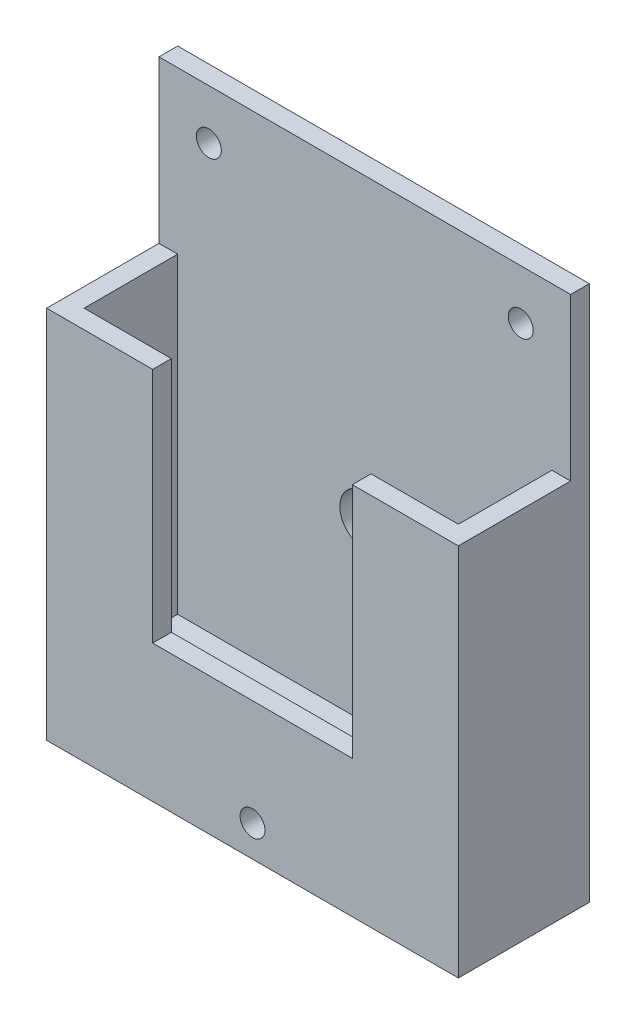
ISO-10303-21;
HEADER;
FILE_DESCRIPTION(('STEP AP214'),'2;1');
FILE_NAME('part.step','',(''),(''),'','','');
FILE_SCHEMA(('AUTOMOTIVE_DESIGN { 1 0 10303 214 1 1 1 1 }'));
ENDSEC;
DATA;
#1=APPLICATION_CONTEXT('core data for automotive mechanical design processes');
#2=APPLICATION_PROTOCOL_DEFINITION('international standard','automotive_design',2000,#1);
#3=PRODUCT_CONTEXT('',#1,'mechanical');
#4=PRODUCT('Part','Part','',(#3));
#5=PRODUCT_RELATED_PRODUCT_CATEGORY('part','',(#4));
#6=PRODUCT_DEFINITION_FORMATION('','',#4);
#7=PRODUCT_DEFINITION_CONTEXT('part definition',#1,'design');
#8=PRODUCT_DEFINITION('design','',#6,#7);
#9=PRODUCT_DEFINITION_SHAPE('','',#8);
#10=(LENGTH_UNIT() NAMED_UNIT(*) SI_UNIT(.MILLI.,.METRE.));
#11=(NAMED_UNIT(*) PLANE_ANGLE_UNIT() SI_UNIT($,.RADIAN.));
#12=(NAMED_UNIT(*) SI_UNIT($,.STERADIAN.) SOLID_ANGLE_UNIT());
#13=UNCERTAINTY_MEASURE_WITH_UNIT(LENGTH_MEASURE(1.E-05),#10,'distance_accuracy_value','');
#14=(GEOMETRIC_REPRESENTATION_CONTEXT(3) GLOBAL_UNCERTAINTY_ASSIGNED_CONTEXT((#13)) GLOBAL_UNIT_ASSIGNED_CONTEXT((#10,
#11,#12)) REPRESENTATION_CONTEXT('',''));
#15=CARTESIAN_POINT('',(0.,0.,0.));
#16=DIRECTION('',(0.,0.,1.));
#17=DIRECTION('',(1.,0.,0.));
#18=AXIS2_PLACEMENT_3D('',#15,#16,#17);
#19=CARTESIAN_POINT('',(-66.,-25.9,3.));
#20=DIRECTION('',(0.,1.,0.));
#21=DIRECTION('',(0.,0.,1.));
#22=AXIS2_PLACEMENT_3D('',#19,#20,#21);
#23=PLANE('',#22);
#24=DIRECTION('',(1.,0.,0.));
#25=VECTOR('',#24,1.);
#26=CARTESIAN_POINT('',(-66.,-25.9,21.));
#27=LINE('',#26,#25);
#28=CARTESIAN_POINT('',(-66.,-25.9,21.));
#29=VERTEX_POINT('',#28);
#30=CARTESIAN_POINT('',(-49.,-25.9,21.));
#31=VERTEX_POINT('',#30);
#32=EDGE_CURVE('E152',#29,#31,#27,.T.);
#33=ORIENTED_EDGE('',*,*,#32,.T.);
#34=DIRECTION('',(0.,0.,-1.));
#35=VECTOR('',#34,1.);
#36=CARTESIAN_POINT('',(-49.,-25.9,21.));
#37=LINE('',#36,#35);
#38=CARTESIAN_POINT('',(-49.,-25.9,18.));
#39=VERTEX_POINT('',#38);
#40=EDGE_CURVE('E134',#31,#39,#37,.T.);
#41=ORIENTED_EDGE('',*,*,#40,.T.);
#42=DIRECTION('',(1.,0.,0.));
#43=VECTOR('',#42,1.);
#44=CARTESIAN_POINT('',(-63.,-25.9,18.));
#45=LINE('',#44,#43);
#46=CARTESIAN_POINT('',(-63.,-25.9,18.));
#47=VERTEX_POINT('',#46);
#48=EDGE_CURVE('E250',#47,#39,#45,.T.);
#49=ORIENTED_EDGE('',*,*,#48,.F.);
#50=DIRECTION('',(0.,0.,1.));
#51=VECTOR('',#50,1.);
#52=CARTESIAN_POINT('',(-63.,-25.9,3.));
#53=LINE('',#52,#51);
#54=CARTESIAN_POINT('',(-63.,-25.9,3.));
#55=VERTEX_POINT('',#54);
#56=EDGE_CURVE('E259',#55,#47,#53,.T.);
#57=ORIENTED_EDGE('',*,*,#56,.F.);
#58=DIRECTION('',(1.,0.,0.));
#59=VECTOR('',#58,1.);
#60=CARTESIAN_POINT('',(-66.,-25.9,3.));
#61=LINE('',#60,#59);
#62=CARTESIAN_POINT('',(-66.,-25.9,3.));
#63=VERTEX_POINT('',#62);
#64=EDGE_CURVE('E165',#63,#55,#61,.T.);
#65=ORIENTED_EDGE('',*,*,#64,.F.);
#66=DIRECTION('',(0.,0.,1.));
#67=VECTOR('',#66,1.);
#68=CARTESIAN_POINT('',(-66.,-25.9,3.));
#69=LINE('',#68,#67);
#70=EDGE_CURVE('E159',#63,#29,#69,.T.);
#71=ORIENTED_EDGE('',*,*,#70,.T.);
#72=EDGE_LOOP('',(#33,#41,#49,#57,#65,#71));
#73=FACE_BOUND('',#72,.T.);
#74=ADVANCED_FACE('F33',(#73),#23,.T.);
#75=CARTESIAN_POINT('',(-17.,-25.9,18.));
#76=VERTEX_POINT('',#75);
#77=CARTESIAN_POINT('',(-3.,-25.9,18.));
#78=VERTEX_POINT('',#77);
#79=EDGE_CURVE('E273',#76,#78,#45,.T.);
#80=ORIENTED_EDGE('',*,*,#79,.F.);
#81=DIRECTION('',(0.,0.,-1.));
#82=VECTOR('',#81,1.);
#83=CARTESIAN_POINT('',(-17.,-25.9,21.));
#84=LINE('',#83,#82);
#85=CARTESIAN_POINT('',(-17.,-25.9,21.));
#86=VERTEX_POINT('',#85);
#87=EDGE_CURVE('E50',#86,#76,#84,.T.);
#88=ORIENTED_EDGE('',*,*,#87,.F.);
#89=CARTESIAN_POINT('',(0.,-25.9,21.));
#90=VERTEX_POINT('',#89);
#91=EDGE_CURVE('E161',#86,#90,#27,.T.);
#92=ORIENTED_EDGE('',*,*,#91,.T.);
#93=DIRECTION('',(0.,0.,1.));
#94=VECTOR('',#93,1.);
#95=CARTESIAN_POINT('',(0.,-25.9,3.));
#96=LINE('',#95,#94);
#97=CARTESIAN_POINT('',(0.,-25.9,3.));
#98=VERTEX_POINT('',#97);
#99=EDGE_CURVE('E208',#98,#90,#96,.T.);
#100=ORIENTED_EDGE('',*,*,#99,.F.);
#101=CARTESIAN_POINT('',(-3.,-25.9,3.));
#102=VERTEX_POINT('',#101);
#103=EDGE_CURVE('E170',#102,#98,#61,.T.);
#104=ORIENTED_EDGE('',*,*,#103,.F.);
#105=DIRECTION('',(0.,0.,1.));
#106=VECTOR('',#105,1.);
#107=CARTESIAN_POINT('',(-3.,-25.9,3.));
#108=LINE('',#107,#106);
#109=EDGE_CURVE('E145',#102,#78,#108,.T.);
#110=ORIENTED_EDGE('',*,*,#109,.T.);
#111=EDGE_LOOP('',(#80,#88,#92,#100,#104,#110));
#112=FACE_BOUND('',#111,.T.);
#113=ADVANCED_FACE('F291',(#112),#23,.T.);
#114=CARTESIAN_POINT('',(-66.,-25.9,21.));
#115=DIRECTION('',(0.,0.,1.));
#116=DIRECTION('',(0.,-1.,0.));
#117=AXIS2_PLACEMENT_3D('',#114,#115,#116);
#118=PLANE('',#117);
#119=CARTESIAN_POINT('',(-33.,-80.9,21.));
#120=DIRECTION('',(0.,0.,-1.));
#121=DIRECTION('',(-1.,0.,0.));
#122=AXIS2_PLACEMENT_3D('',#119,#120,#121);
#123=CIRCLE('',#122,2.);
#124=CARTESIAN_POINT('',(-35.,-80.9,21.));
#125=VERTEX_POINT('',#124);
#126=EDGE_CURVE('E422',#125,#125,#123,.T.);
#127=ORIENTED_EDGE('',*,*,#126,.T.);
#128=EDGE_LOOP('',(#127));
#129=FACE_BOUND('',#128,.T.);
#130=DIRECTION('',(1.,0.,0.));
#131=VECTOR('',#130,1.);
#132=CARTESIAN_POINT('',(-49.,-63.9,21.));
#133=LINE('',#132,#131);
#134=CARTESIAN_POINT('',(-49.,-63.9,21.));
#135=VERTEX_POINT('',#134);
#136=CARTESIAN_POINT('',(-17.,-63.9,21.));
#137=VERTEX_POINT('',#136);
#138=EDGE_CURVE('E155',#135,#137,#133,.T.);
#139=ORIENTED_EDGE('',*,*,#138,.F.);
#140=DIRECTION('',(0.,-1.,0.));
#141=VECTOR('',#140,1.);
#142=CARTESIAN_POINT('',(-49.,-25.9,21.));
#143=LINE('',#142,#141);
#144=EDGE_CURVE('E138',#31,#135,#143,.T.);
#145=ORIENTED_EDGE('',*,*,#144,.F.);
#146=ORIENTED_EDGE('',*,*,#32,.F.);
#147=DIRECTION('',(0.,-1.,0.));
#148=VECTOR('',#147,1.);
#149=CARTESIAN_POINT('',(-66.,-25.9,21.));
#150=LINE('',#149,#148);
#151=CARTESIAN_POINT('',(-66.,-85.9,21.));
#152=VERTEX_POINT('',#151);
#153=EDGE_CURVE('E254',#29,#152,#150,.T.);
#154=ORIENTED_EDGE('',*,*,#153,.T.);
#155=DIRECTION('',(1.,0.,0.));
#156=VECTOR('',#155,1.);
#157=CARTESIAN_POINT('',(-66.,-85.9,21.));
#158=LINE('',#157,#156);
#159=CARTESIAN_POINT('',(0.,-85.9,21.));
#160=VERTEX_POINT('',#159);
#161=EDGE_CURVE('E160',#152,#160,#158,.T.);
#162=ORIENTED_EDGE('',*,*,#161,.T.);
#163=DIRECTION('',(0.,-1.,0.));
#164=VECTOR('',#163,1.);
#165=CARTESIAN_POINT('',(0.,-25.9,21.));
#166=LINE('',#165,#164);
#167=EDGE_CURVE('E226',#90,#160,#166,.T.);
#168=ORIENTED_EDGE('',*,*,#167,.F.);
#169=ORIENTED_EDGE('',*,*,#91,.F.);
#170=DIRECTION('',(0.,1.,0.));
#171=VECTOR('',#170,1.);
#172=CARTESIAN_POINT('',(-17.,-63.9,21.));
#173=LINE('',#172,#171);
#174=EDGE_CURVE('E293',#137,#86,#173,.T.);
#175=ORIENTED_EDGE('',*,*,#174,.F.);
#176=EDGE_LOOP('',(#139,#145,#146,#154,#162,#168,#169,#175));
#177=FACE_BOUND('',#176,.T.);
#178=ADVANCED_FACE('F150',(#129,#177),#118,.T.);
#179=CARTESIAN_POINT('',(-63.,-25.9,18.));
#180=DIRECTION('',(0.,0.,1.));
#181=DIRECTION('',(0.,-1.,0.));
#182=AXIS2_PLACEMENT_3D('',#179,#180,#181);
#183=PLANE('',#182);
#184=DIRECTION('',(0.,1.,0.));
#185=VECTOR('',#184,1.);
#186=CARTESIAN_POINT('',(-49.,-25.9,18.));
#187=LINE('',#186,#185);
#188=CARTESIAN_POINT('',(-49.,-63.9,18.));
#189=VERTEX_POINT('',#188);
#190=EDGE_CURVE('E11',#189,#39,#187,.T.);
#191=ORIENTED_EDGE('',*,*,#190,.F.);
#192=DIRECTION('',(-1.,0.,0.));
#193=VECTOR('',#192,1.);
#194=CARTESIAN_POINT('',(-63.,-63.9,18.));
#195=LINE('',#194,#193);
#196=CARTESIAN_POINT('',(-17.,-63.9,18.));
#197=VERTEX_POINT('',#196);
#198=EDGE_CURVE('E42',#197,#189,#195,.T.);
#199=ORIENTED_EDGE('',*,*,#198,.F.);
#200=DIRECTION('',(0.,-1.,0.));
#201=VECTOR('',#200,1.);
#202=CARTESIAN_POINT('',(-17.,-25.9,18.));
#203=LINE('',#202,#201);
#204=EDGE_CURVE('E174',#76,#197,#203,.T.);
#205=ORIENTED_EDGE('',*,*,#204,.F.);
#206=ORIENTED_EDGE('',*,*,#79,.T.);
#207=DIRECTION('',(0.,-1.,0.));
#208=VECTOR('',#207,1.);
#209=CARTESIAN_POINT('',(-3.,-25.9,18.));
#210=LINE('',#209,#208);
#211=CARTESIAN_POINT('',(-3.,-75.9,18.));
#212=VERTEX_POINT('',#211);
#213=EDGE_CURVE('E276',#78,#212,#210,.T.);
#214=ORIENTED_EDGE('',*,*,#213,.T.);
#215=DIRECTION('',(1.,0.,0.));
#216=VECTOR('',#215,1.);
#217=CARTESIAN_POINT('',(-63.,-75.9,18.));
#218=LINE('',#217,#216);
#219=CARTESIAN_POINT('',(-63.,-75.9,18.));
#220=VERTEX_POINT('',#219);
#221=EDGE_CURVE('E220',#220,#212,#218,.T.);
#222=ORIENTED_EDGE('',*,*,#221,.F.);
#223=DIRECTION('',(0.,-1.,0.));
#224=VECTOR('',#223,1.);
#225=CARTESIAN_POINT('',(-63.,-25.9,18.));
#226=LINE('',#225,#224);
#227=EDGE_CURVE('E262',#47,#220,#226,.T.);
#228=ORIENTED_EDGE('',*,*,#227,.F.);
#229=ORIENTED_EDGE('',*,*,#48,.T.);
#230=EDGE_LOOP('',(#191,#199,#205,#206,#214,#222,#228,#229));
#231=FACE_BOUND('',#230,.T.);
#232=ADVANCED_FACE('F286',(#231),#183,.F.);
#233=CARTESIAN_POINT('',(-66.,0.,3.));
#234=DIRECTION('',(0.,1.,0.));
#235=DIRECTION('',(0.,0.,1.));
#236=AXIS2_PLACEMENT_3D('',#233,#234,#235);
#237=PLANE('',#236);
#238=DIRECTION('',(0.,0.,1.));
#239=VECTOR('',#238,1.);
#240=CARTESIAN_POINT('',(0.,0.,3.));
#241=LINE('',#240,#239);
#242=CARTESIAN_POINT('',(0.,0.,0.));
#243=VERTEX_POINT('',#242);
#244=CARTESIAN_POINT('',(0.,0.,3.));
#245=VERTEX_POINT('',#244);
#246=EDGE_CURVE('E209',#243,#245,#241,.T.);
#247=ORIENTED_EDGE('',*,*,#246,.F.);
#248=DIRECTION('',(1.,0.,0.));
#249=VECTOR('',#248,1.);
#250=CARTESIAN_POINT('',(-66.,0.,0.));
#251=LINE('',#250,#249);
#252=CARTESIAN_POINT('',(-66.,0.,0.));
#253=VERTEX_POINT('',#252);
#254=EDGE_CURVE('E176',#253,#243,#251,.T.);
#255=ORIENTED_EDGE('',*,*,#254,.F.);
#256=DIRECTION('',(0.,0.,1.));
#257=VECTOR('',#256,1.);
#258=CARTESIAN_POINT('',(-66.,0.,3.));
#259=LINE('',#258,#257);
#260=CARTESIAN_POINT('',(-66.,0.,3.));
#261=VERTEX_POINT('',#260);
#262=EDGE_CURVE('E232',#253,#261,#259,.T.);
#263=ORIENTED_EDGE('',*,*,#262,.T.);
#264=DIRECTION('',(1.,0.,0.));
#265=VECTOR('',#264,1.);
#266=CARTESIAN_POINT('',(-66.,0.,3.));
#267=LINE('',#266,#265);
#268=EDGE_CURVE('E171',#261,#245,#267,.T.);
#269=ORIENTED_EDGE('',*,*,#268,.T.);
#270=EDGE_LOOP('',(#247,#255,#263,#269));
#271=FACE_BOUND('',#270,.T.);
#272=ADVANCED_FACE('F35',(#271),#237,.T.);
#273=CARTESIAN_POINT('',(-66.,-85.9,0.));
#274=DIRECTION('',(0.,0.,-1.));
#275=DIRECTION('',(-1.,0.,0.));
#276=AXIS2_PLACEMENT_3D('',#273,#274,#275);
#277=PLANE('',#276);
#278=CARTESIAN_POINT('',(-8.,-8.00000000000001,0.));
#279=DIRECTION('',(0.,0.,-1.));
#280=DIRECTION('',(-1.,0.,0.));
#281=AXIS2_PLACEMENT_3D('',#278,#279,#280);
#282=CIRCLE('',#281,2.);
#283=CARTESIAN_POINT('',(-10.,-8.00000000000001,0.));
#284=VERTEX_POINT('',#283);
#285=EDGE_CURVE('E431',#284,#284,#282,.T.);
#286=ORIENTED_EDGE('',*,*,#285,.F.);
#287=EDGE_LOOP('',(#286));
#288=FACE_BOUND('',#287,.T.);
#289=CARTESIAN_POINT('',(-58.,-7.99999999999999,0.));
#290=DIRECTION('',(0.,0.,-1.));
#291=DIRECTION('',(-1.,0.,0.));
#292=AXIS2_PLACEMENT_3D('',#289,#290,#291);
#293=CIRCLE('',#292,2.);
#294=CARTESIAN_POINT('',(-60.,-7.99999999999999,0.));
#295=VERTEX_POINT('',#294);
#296=EDGE_CURVE('E427',#295,#295,#293,.T.);
#297=ORIENTED_EDGE('',*,*,#296,.F.);
#298=EDGE_LOOP('',(#297));
#299=FACE_BOUND('',#298,.T.);
#300=CARTESIAN_POINT('',(-33.,-80.9,0.));
#301=DIRECTION('',(0.,0.,-1.));
#302=DIRECTION('',(-1.,0.,0.));
#303=AXIS2_PLACEMENT_3D('',#300,#301,#302);
#304=CIRCLE('',#303,2.);
#305=CARTESIAN_POINT('',(-35.,-80.9,0.));
#306=VERTEX_POINT('',#305);
#307=EDGE_CURVE('E425',#306,#306,#304,.T.);
#308=ORIENTED_EDGE('',*,*,#307,.F.);
#309=EDGE_LOOP('',(#308));
#310=FACE_BOUND('',#309,.T.);
#311=CARTESIAN_POINT('',(-33.,-47.9,0.));
#312=DIRECTION('',(0.,0.,-1.));
#313=DIRECTION('',(-1.,0.,0.));
#314=AXIS2_PLACEMENT_3D('',#311,#312,#313);
#315=CIRCLE('',#314,4.);
#316=CARTESIAN_POINT('',(-37.,-47.9,0.));
#317=VERTEX_POINT('',#316);
#318=EDGE_CURVE('E181',#317,#317,#315,.T.);
#319=ORIENTED_EDGE('',*,*,#318,.F.);
#320=EDGE_LOOP('',(#319));
#321=FACE_BOUND('',#320,.T.);
#322=DIRECTION('',(0.,1.,0.));
#323=VECTOR('',#322,1.);
#324=CARTESIAN_POINT('',(0.,-85.9,0.));
#325=LINE('',#324,#323);
#326=CARTESIAN_POINT('',(0.,-85.9,0.));
#327=VERTEX_POINT('',#326);
#328=EDGE_CURVE('E216',#327,#243,#325,.T.);
#329=ORIENTED_EDGE('',*,*,#328,.F.);
#330=DIRECTION('',(1.,0.,0.));
#331=VECTOR('',#330,1.);
#332=CARTESIAN_POINT('',(-66.,-85.9,0.));
#333=LINE('',#332,#331);
#334=CARTESIAN_POINT('',(-66.,-85.9,0.));
#335=VERTEX_POINT('',#334);
#336=EDGE_CURVE('E163',#335,#327,#333,.T.);
#337=ORIENTED_EDGE('',*,*,#336,.F.);
#338=DIRECTION('',(0.,1.,0.));
#339=VECTOR('',#338,1.);
#340=CARTESIAN_POINT('',(-66.,-85.9,0.));
#341=LINE('',#340,#339);
#342=EDGE_CURVE('E173',#335,#253,#341,.T.);
#343=ORIENTED_EDGE('',*,*,#342,.T.);
#344=ORIENTED_EDGE('',*,*,#254,.T.);
#345=EDGE_LOOP('',(#329,#337,#343,#344));
#346=FACE_BOUND('',#345,.T.);
#347=ADVANCED_FACE('F242',(#288,#299,#310,#321,#346),#277,.T.);
#348=CARTESIAN_POINT('',(-66.,-85.9,21.));
#349=DIRECTION('',(0.,-1.,0.));
#350=DIRECTION('',(0.,0.,-1.));
#351=AXIS2_PLACEMENT_3D('',#348,#349,#350);
#352=PLANE('',#351);
#353=DIRECTION('',(0.,0.,-1.));
#354=VECTOR('',#353,1.);
#355=CARTESIAN_POINT('',(0.,-85.9,21.));
#356=LINE('',#355,#354);
#357=EDGE_CURVE('E229',#160,#327,#356,.T.);
#358=ORIENTED_EDGE('',*,*,#357,.F.);
#359=ORIENTED_EDGE('',*,*,#161,.F.);
#360=DIRECTION('',(0.,0.,-1.));
#361=VECTOR('',#360,1.);
#362=CARTESIAN_POINT('',(-66.,-85.9,21.));
#363=LINE('',#362,#361);
#364=EDGE_CURVE('E237',#152,#335,#363,.T.);
#365=ORIENTED_EDGE('',*,*,#364,.T.);
#366=ORIENTED_EDGE('',*,*,#336,.T.);
#367=EDGE_LOOP('',(#358,#359,#365,#366));
#368=FACE_BOUND('',#367,.T.);
#369=ADVANCED_FACE('F195',(#368),#352,.T.);
#370=CARTESIAN_POINT('',(-66.,-25.9,3.));
#371=DIRECTION('',(0.,0.,1.));
#372=DIRECTION('',(1.,0.,0.));
#373=AXIS2_PLACEMENT_3D('',#370,#371,#372);
#374=PLANE('',#373);
#375=CARTESIAN_POINT('',(-8.,-8.00000000000001,3.));
#376=DIRECTION('',(0.,0.,1.));
#377=DIRECTION('',(1.,0.,0.));
#378=AXIS2_PLACEMENT_3D('',#375,#376,#377);
#379=CIRCLE('',#378,2.);
#380=CARTESIAN_POINT('',(-6.,-8.00000000000001,3.));
#381=VERTEX_POINT('',#380);
#382=EDGE_CURVE('E37',#381,#381,#379,.T.);
#383=ORIENTED_EDGE('',*,*,#382,.F.);
#384=EDGE_LOOP('',(#383));
#385=FACE_BOUND('',#384,.T.);
#386=CARTESIAN_POINT('',(-58.,-7.99999999999999,3.));
#387=DIRECTION('',(0.,0.,1.));
#388=DIRECTION('',(1.,0.,0.));
#389=AXIS2_PLACEMENT_3D('',#386,#387,#388);
#390=CIRCLE('',#389,2.);
#391=CARTESIAN_POINT('',(-56.,-7.99999999999999,3.));
#392=VERTEX_POINT('',#391);
#393=EDGE_CURVE('E180',#392,#392,#390,.T.);
#394=ORIENTED_EDGE('',*,*,#393,.F.);
#395=EDGE_LOOP('',(#394));
#396=FACE_BOUND('',#395,.T.);
#397=CARTESIAN_POINT('',(-33.,-47.9,3.));
#398=DIRECTION('',(0.,0.,1.));
#399=DIRECTION('',(1.,0.,0.));
#400=AXIS2_PLACEMENT_3D('',#397,#398,#399);
#401=CIRCLE('',#400,4.);
#402=CARTESIAN_POINT('',(-29.,-47.9,3.));
#403=VERTEX_POINT('',#402);
#404=EDGE_CURVE('E178',#403,#403,#401,.T.);
#405=ORIENTED_EDGE('',*,*,#404,.F.);
#406=EDGE_LOOP('',(#405));
#407=FACE_BOUND('',#406,.T.);
#408=DIRECTION('',(0.,-1.,0.));
#409=VECTOR('',#408,1.);
#410=CARTESIAN_POINT('',(0.,-25.9,3.));
#411=LINE('',#410,#409);
#412=EDGE_CURVE('E200',#245,#98,#411,.T.);
#413=ORIENTED_EDGE('',*,*,#412,.F.);
#414=ORIENTED_EDGE('',*,*,#268,.F.);
#415=DIRECTION('',(0.,-1.,0.));
#416=VECTOR('',#415,1.);
#417=CARTESIAN_POINT('',(-66.,-25.9,3.));
#418=LINE('',#417,#416);
#419=EDGE_CURVE('E246',#261,#63,#418,.T.);
#420=ORIENTED_EDGE('',*,*,#419,.T.);
#421=ORIENTED_EDGE('',*,*,#64,.T.);
#422=DIRECTION('',(0.,1.,0.));
#423=VECTOR('',#422,1.);
#424=CARTESIAN_POINT('',(-63.,-75.9,3.));
#425=LINE('',#424,#423);
#426=CARTESIAN_POINT('',(-63.,-75.9,3.));
#427=VERTEX_POINT('',#426);
#428=EDGE_CURVE('E256',#427,#55,#425,.T.);
#429=ORIENTED_EDGE('',*,*,#428,.F.);
#430=DIRECTION('',(1.,0.,0.));
#431=VECTOR('',#430,1.);
#432=CARTESIAN_POINT('',(-63.,-75.9,3.));
#433=LINE('',#432,#431);
#434=CARTESIAN_POINT('',(-3.,-75.9,3.));
#435=VERTEX_POINT('',#434);
#436=EDGE_CURVE('E218',#427,#435,#433,.T.);
#437=ORIENTED_EDGE('',*,*,#436,.T.);
#438=DIRECTION('',(0.,1.,0.));
#439=VECTOR('',#438,1.);
#440=CARTESIAN_POINT('',(-3.,-75.9,3.));
#441=LINE('',#440,#439);
#442=EDGE_CURVE('E58',#435,#102,#441,.T.);
#443=ORIENTED_EDGE('',*,*,#442,.T.);
#444=ORIENTED_EDGE('',*,*,#103,.T.);
#445=EDGE_LOOP('',(#413,#414,#420,#421,#429,#437,#443,#444));
#446=FACE_BOUND('',#445,.T.);
#447=ADVANCED_FACE('F191',(#385,#396,#407,#446),#374,.T.);
#448=CARTESIAN_POINT('',(-66.,0.,0.));
#449=DIRECTION('',(1.,0.,0.));
#450=DIRECTION('',(0.,0.,-1.));
#451=AXIS2_PLACEMENT_3D('',#448,#449,#450);
#452=PLANE('',#451);
#453=ORIENTED_EDGE('',*,*,#262,.F.);
#454=ORIENTED_EDGE('',*,*,#342,.F.);
#455=ORIENTED_EDGE('',*,*,#364,.F.);
#456=ORIENTED_EDGE('',*,*,#153,.F.);
#457=ORIENTED_EDGE('',*,*,#70,.F.);
#458=ORIENTED_EDGE('',*,*,#419,.F.);
#459=EDGE_LOOP('',(#453,#454,#455,#456,#457,#458));
#460=FACE_BOUND('',#459,.T.);
#461=ADVANCED_FACE('F194',(#460),#452,.F.);
#462=CARTESIAN_POINT('',(0.,0.,0.));
#463=DIRECTION('',(1.,0.,0.));
#464=DIRECTION('',(0.,0.,-1.));
#465=AXIS2_PLACEMENT_3D('',#462,#463,#464);
#466=PLANE('',#465);
#467=ORIENTED_EDGE('',*,*,#246,.T.);
#468=ORIENTED_EDGE('',*,*,#412,.T.);
#469=ORIENTED_EDGE('',*,*,#99,.T.);
#470=ORIENTED_EDGE('',*,*,#167,.T.);
#471=ORIENTED_EDGE('',*,*,#357,.T.);
#472=ORIENTED_EDGE('',*,*,#328,.T.);
#473=EDGE_LOOP('',(#467,#468,#469,#470,#471,#472));
#474=FACE_BOUND('',#473,.T.);
#475=ADVANCED_FACE('F213',(#474),#466,.T.);
#476=CARTESIAN_POINT('',(-63.,-75.9,18.));
#477=DIRECTION('',(0.,-1.,0.));
#478=DIRECTION('',(0.,0.,-1.));
#479=AXIS2_PLACEMENT_3D('',#476,#477,#478);
#480=PLANE('',#479);
#481=DIRECTION('',(0.,0.,-1.));
#482=VECTOR('',#481,1.);
#483=CARTESIAN_POINT('',(-3.,-75.9,18.));
#484=LINE('',#483,#482);
#485=EDGE_CURVE('E266',#212,#435,#484,.T.);
#486=ORIENTED_EDGE('',*,*,#485,.T.);
#487=ORIENTED_EDGE('',*,*,#436,.F.);
#488=DIRECTION('',(0.,0.,-1.));
#489=VECTOR('',#488,1.);
#490=CARTESIAN_POINT('',(-63.,-75.9,18.));
#491=LINE('',#490,#489);
#492=EDGE_CURVE('E264',#220,#427,#491,.T.);
#493=ORIENTED_EDGE('',*,*,#492,.F.);
#494=ORIENTED_EDGE('',*,*,#221,.T.);
#495=EDGE_LOOP('',(#486,#487,#493,#494));
#496=FACE_BOUND('',#495,.T.);
#497=ADVANCED_FACE('F331',(#496),#480,.F.);
#498=CARTESIAN_POINT('',(-63.,0.,0.));
#499=DIRECTION('',(1.,0.,0.));
#500=DIRECTION('',(0.,0.,-1.));
#501=AXIS2_PLACEMENT_3D('',#498,#499,#500);
#502=PLANE('',#501);
#503=ORIENTED_EDGE('',*,*,#56,.T.);
#504=ORIENTED_EDGE('',*,*,#227,.T.);
#505=ORIENTED_EDGE('',*,*,#492,.T.);
#506=ORIENTED_EDGE('',*,*,#428,.T.);
#507=EDGE_LOOP('',(#503,#504,#505,#506));
#508=FACE_BOUND('',#507,.T.);
#509=ADVANCED_FACE('F338',(#508),#502,.T.);
#510=CARTESIAN_POINT('',(-3.,0.,0.));
#511=DIRECTION('',(1.,0.,0.));
#512=DIRECTION('',(0.,0.,-1.));
#513=AXIS2_PLACEMENT_3D('',#510,#511,#512);
#514=PLANE('',#513);
#515=ORIENTED_EDGE('',*,*,#109,.F.);
#516=ORIENTED_EDGE('',*,*,#442,.F.);
#517=ORIENTED_EDGE('',*,*,#485,.F.);
#518=ORIENTED_EDGE('',*,*,#213,.F.);
#519=EDGE_LOOP('',(#515,#516,#517,#518));
#520=FACE_BOUND('',#519,.T.);
#521=ADVANCED_FACE('F290',(#520),#514,.F.);
#522=CARTESIAN_POINT('',(-49.,-25.9,21.));
#523=DIRECTION('',(1.,0.,0.));
#524=DIRECTION('',(0.,1.,0.));
#525=AXIS2_PLACEMENT_3D('',#522,#523,#524);
#526=PLANE('',#525);
#527=ORIENTED_EDGE('',*,*,#190,.T.);
#528=ORIENTED_EDGE('',*,*,#40,.F.);
#529=ORIENTED_EDGE('',*,*,#144,.T.);
#530=DIRECTION('',(0.,0.,-1.));
#531=VECTOR('',#530,1.);
#532=CARTESIAN_POINT('',(-49.,-63.9,21.));
#533=LINE('',#532,#531);
#534=EDGE_CURVE('E146',#135,#189,#533,.T.);
#535=ORIENTED_EDGE('',*,*,#534,.T.);
#536=EDGE_LOOP('',(#527,#528,#529,#535));
#537=FACE_BOUND('',#536,.T.);
#538=ADVANCED_FACE('F136',(#537),#526,.T.);
#539=CARTESIAN_POINT('',(-49.,-63.9,21.));
#540=DIRECTION('',(0.,1.,0.));
#541=DIRECTION('',(0.,0.,1.));
#542=AXIS2_PLACEMENT_3D('',#539,#540,#541);
#543=PLANE('',#542);
#544=ORIENTED_EDGE('',*,*,#198,.T.);
#545=ORIENTED_EDGE('',*,*,#534,.F.);
#546=ORIENTED_EDGE('',*,*,#138,.T.);
#547=DIRECTION('',(0.,0.,-1.));
#548=VECTOR('',#547,1.);
#549=CARTESIAN_POINT('',(-17.,-63.9,21.));
#550=LINE('',#549,#548);
#551=EDGE_CURVE('E296',#137,#197,#550,.T.);
#552=ORIENTED_EDGE('',*,*,#551,.T.);
#553=EDGE_LOOP('',(#544,#545,#546,#552));
#554=FACE_BOUND('',#553,.T.);
#555=ADVANCED_FACE('F302',(#554),#543,.T.);
#556=CARTESIAN_POINT('',(-17.,-63.9,21.));
#557=DIRECTION('',(-1.,0.,0.));
#558=DIRECTION('',(0.,0.,1.));
#559=AXIS2_PLACEMENT_3D('',#556,#557,#558);
#560=PLANE('',#559);
#561=ORIENTED_EDGE('',*,*,#204,.T.);
#562=ORIENTED_EDGE('',*,*,#551,.F.);
#563=ORIENTED_EDGE('',*,*,#174,.T.);
#564=ORIENTED_EDGE('',*,*,#87,.T.);
#565=EDGE_LOOP('',(#561,#562,#563,#564));
#566=FACE_BOUND('',#565,.T.);
#567=ADVANCED_FACE('F303',(#566),#560,.T.);
#568=CARTESIAN_POINT('',(-33.,-47.9,21.));
#569=DIRECTION('',(0.,0.,-1.));
#570=DIRECTION('',(-1.,0.,0.));
#571=AXIS2_PLACEMENT_3D('',#568,#569,#570);
#572=CYLINDRICAL_SURFACE('',#571,4.);
#573=ORIENTED_EDGE('',*,*,#404,.T.);
#574=EDGE_LOOP('',(#573));
#575=FACE_BOUND('',#574,.T.);
#576=ORIENTED_EDGE('',*,*,#318,.T.);
#577=EDGE_LOOP('',(#576));
#578=FACE_BOUND('',#577,.T.);
#579=ADVANCED_FACE('F305',(#575,#578),#572,.F.);
#580=CARTESIAN_POINT('',(-58.,-7.99999999999999,21.));
#581=DIRECTION('',(0.,0.,-1.));
#582=DIRECTION('',(-1.,0.,0.));
#583=AXIS2_PLACEMENT_3D('',#580,#581,#582);
#584=CYLINDRICAL_SURFACE('',#583,2.);
#585=ORIENTED_EDGE('',*,*,#393,.T.);
#586=EDGE_LOOP('',(#585));
#587=FACE_BOUND('',#586,.T.);
#588=ORIENTED_EDGE('',*,*,#296,.T.);
#589=EDGE_LOOP('',(#588));
#590=FACE_BOUND('',#589,.T.);
#591=ADVANCED_FACE('F311',(#587,#590),#584,.F.);
#592=CARTESIAN_POINT('',(-8.,-8.00000000000001,21.));
#593=DIRECTION('',(0.,0.,-1.));
#594=DIRECTION('',(-1.,0.,0.));
#595=AXIS2_PLACEMENT_3D('',#592,#593,#594);
#596=CYLINDRICAL_SURFACE('',#595,2.);
#597=ORIENTED_EDGE('',*,*,#382,.T.);
#598=EDGE_LOOP('',(#597));
#599=FACE_BOUND('',#598,.T.);
#600=ORIENTED_EDGE('',*,*,#285,.T.);
#601=EDGE_LOOP('',(#600));
#602=FACE_BOUND('',#601,.T.);
#603=ADVANCED_FACE('F188',(#599,#602),#596,.F.);
#604=CARTESIAN_POINT('',(-33.,-80.9,21.));
#605=DIRECTION('',(0.,0.,-1.));
#606=DIRECTION('',(-1.,0.,0.));
#607=AXIS2_PLACEMENT_3D('',#604,#605,#606);
#608=CYLINDRICAL_SURFACE('',#607,2.);
#609=ORIENTED_EDGE('',*,*,#126,.F.);
#610=EDGE_LOOP('',(#609));
#611=FACE_BOUND('',#610,.T.);
#612=ORIENTED_EDGE('',*,*,#307,.T.);
#613=EDGE_LOOP('',(#612));
#614=FACE_BOUND('',#613,.T.);
#615=ADVANCED_FACE('F406',(#611,#614),#608,.F.);
#616=CLOSED_SHELL('',(#74,#113,#178,#232,#272,#347,#369,#447,#461,#475,#497,#509,#521,#538,#555,
#567,#579,#591,#603,#615));
#617=MANIFOLD_SOLID_BREP('B2',#616);
#618=ADVANCED_BREP_SHAPE_REPRESENTATION('',(#18,#617),#14);
#619=SHAPE_DEFINITION_REPRESENTATION(#9,#618);
ENDSEC;
END-ISO-10303-21;
